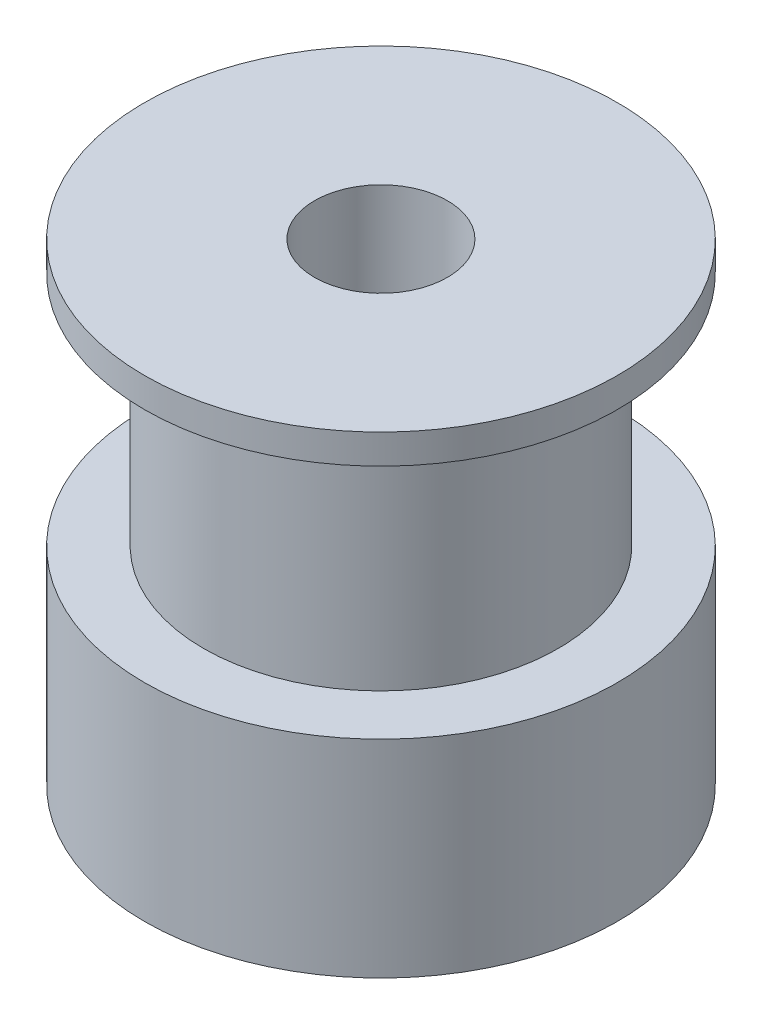
ISO-10303-21;
HEADER;
FILE_DESCRIPTION(('STEP AP214'),'2;1');
FILE_NAME('part.step','',(''),(''),'','','');
FILE_SCHEMA(('AUTOMOTIVE_DESIGN { 1 0 10303 214 1 1 1 1 }'));
ENDSEC;
DATA;
#1=APPLICATION_CONTEXT('core data for automotive mechanical design processes');
#2=APPLICATION_PROTOCOL_DEFINITION('international standard','automotive_design',2000,#1);
#3=PRODUCT_CONTEXT('',#1,'mechanical');
#4=PRODUCT('Part','Part','',(#3));
#5=PRODUCT_RELATED_PRODUCT_CATEGORY('part','',(#4));
#6=PRODUCT_DEFINITION_FORMATION('','',#4);
#7=PRODUCT_DEFINITION_CONTEXT('part definition',#1,'design');
#8=PRODUCT_DEFINITION('design','',#6,#7);
#9=PRODUCT_DEFINITION_SHAPE('','',#8);
#10=(LENGTH_UNIT() NAMED_UNIT(*) SI_UNIT(.MILLI.,.METRE.));
#11=(NAMED_UNIT(*) PLANE_ANGLE_UNIT() SI_UNIT($,.RADIAN.));
#12=(NAMED_UNIT(*) SI_UNIT($,.STERADIAN.) SOLID_ANGLE_UNIT());
#13=UNCERTAINTY_MEASURE_WITH_UNIT(LENGTH_MEASURE(1.E-05),#10,'distance_accuracy_value','');
#14=(GEOMETRIC_REPRESENTATION_CONTEXT(3) GLOBAL_UNCERTAINTY_ASSIGNED_CONTEXT((#13)) GLOBAL_UNIT_ASSIGNED_CONTEXT((#10,
#11,#12)) REPRESENTATION_CONTEXT('',''));
#15=CARTESIAN_POINT('',(0.,0.,0.));
#16=DIRECTION('',(0.,0.,1.));
#17=DIRECTION('',(1.,0.,0.));
#18=AXIS2_PLACEMENT_3D('',#15,#16,#17);
#19=CARTESIAN_POINT('',(0.,7.,0.));
#20=DIRECTION('',(0.,1.,0.));
#21=DIRECTION('',(0.,0.,1.));
#22=AXIS2_PLACEMENT_3D('',#19,#20,#21);
#23=PLANE('',#22);
#24=CARTESIAN_POINT('',(0.,7.,0.));
#25=DIRECTION('',(0.,1.,0.));
#26=DIRECTION('',(0.,0.,1.));
#27=AXIS2_PLACEMENT_3D('',#24,#25,#26);
#28=CIRCLE('',#27,8.);
#29=CARTESIAN_POINT('',(0.,7.,8.));
#30=VERTEX_POINT('',#29);
#31=EDGE_CURVE('E10',#30,#30,#28,.T.);
#32=ORIENTED_EDGE('',*,*,#31,.T.);
#33=EDGE_LOOP('',(#32));
#34=FACE_BOUND('',#33,.T.);
#35=CARTESIAN_POINT('',(0.,7.,0.));
#36=DIRECTION('',(0.,1.,0.));
#37=DIRECTION('',(0.,0.,1.));
#38=AXIS2_PLACEMENT_3D('',#35,#36,#37);
#39=CIRCLE('',#38,6.);
#40=CARTESIAN_POINT('',(0.,7.,6.));
#41=VERTEX_POINT('',#40);
#42=EDGE_CURVE('E42',#41,#41,#39,.T.);
#43=ORIENTED_EDGE('',*,*,#42,.F.);
#44=EDGE_LOOP('',(#43));
#45=FACE_BOUND('',#44,.T.);
#46=ADVANCED_FACE('F29',(#34,#45),#23,.T.);
#47=CARTESIAN_POINT('',(0.,7.,0.));
#48=DIRECTION('',(0.,-1.,0.));
#49=DIRECTION('',(0.,0.,-1.));
#50=AXIS2_PLACEMENT_3D('',#47,#48,#49);
#51=CYLINDRICAL_SURFACE('',#50,8.);
#52=ORIENTED_EDGE('',*,*,#31,.F.);
#53=EDGE_LOOP('',(#52));
#54=FACE_BOUND('',#53,.T.);
#55=CARTESIAN_POINT('',(0.,0.,0.));
#56=DIRECTION('',(0.,1.,0.));
#57=DIRECTION('',(0.,0.,1.));
#58=AXIS2_PLACEMENT_3D('',#55,#56,#57);
#59=CIRCLE('',#58,8.);
#60=CARTESIAN_POINT('',(0.,0.,8.));
#61=VERTEX_POINT('',#60);
#62=EDGE_CURVE('E33',#61,#61,#59,.T.);
#63=ORIENTED_EDGE('',*,*,#62,.T.);
#64=EDGE_LOOP('',(#63));
#65=FACE_BOUND('',#64,.T.);
#66=ADVANCED_FACE('F31',(#54,#65),#51,.T.);
#67=CARTESIAN_POINT('',(0.,0.,0.));
#68=DIRECTION('',(0.,1.,0.));
#69=DIRECTION('',(0.,0.,1.));
#70=AXIS2_PLACEMENT_3D('',#67,#68,#69);
#71=PLANE('',#70);
#72=CARTESIAN_POINT('',(0.,0.,0.));
#73=DIRECTION('',(0.,1.,0.));
#74=DIRECTION('',(0.,0.,1.));
#75=AXIS2_PLACEMENT_3D('',#72,#73,#74);
#76=CIRCLE('',#75,2.25);
#77=CARTESIAN_POINT('',(0.,0.,2.25));
#78=VERTEX_POINT('',#77);
#79=EDGE_CURVE('E51',#78,#78,#76,.F.);
#80=ORIENTED_EDGE('',*,*,#79,.F.);
#81=EDGE_LOOP('',(#80));
#82=FACE_BOUND('',#81,.T.);
#83=ORIENTED_EDGE('',*,*,#62,.F.);
#84=EDGE_LOOP('',(#83));
#85=FACE_BOUND('',#84,.T.);
#86=ADVANCED_FACE('F84',(#82,#85),#71,.F.);
#87=CARTESIAN_POINT('',(0.,15.,0.));
#88=DIRECTION('',(0.,-1.,0.));
#89=DIRECTION('',(0.,0.,-1.));
#90=AXIS2_PLACEMENT_3D('',#87,#88,#89);
#91=CYLINDRICAL_SURFACE('',#90,6.);
#92=CARTESIAN_POINT('',(0.,15.,0.));
#93=DIRECTION('',(0.,1.,0.));
#94=DIRECTION('',(0.,0.,1.));
#95=AXIS2_PLACEMENT_3D('',#92,#93,#94);
#96=CIRCLE('',#95,6.);
#97=CARTESIAN_POINT('',(0.,15.,6.));
#98=VERTEX_POINT('',#97);
#99=EDGE_CURVE('E40',#98,#98,#96,.T.);
#100=ORIENTED_EDGE('',*,*,#99,.F.);
#101=EDGE_LOOP('',(#100));
#102=FACE_BOUND('',#101,.T.);
#103=ORIENTED_EDGE('',*,*,#42,.T.);
#104=EDGE_LOOP('',(#103));
#105=FACE_BOUND('',#104,.T.);
#106=ADVANCED_FACE('F78',(#102,#105),#91,.T.);
#107=CARTESIAN_POINT('',(0.,15.,0.));
#108=DIRECTION('',(0.,1.,0.));
#109=DIRECTION('',(0.,0.,1.));
#110=AXIS2_PLACEMENT_3D('',#107,#108,#109);
#111=PLANE('',#110);
#112=CARTESIAN_POINT('',(0.,15.,0.));
#113=DIRECTION('',(0.,1.,0.));
#114=DIRECTION('',(0.,0.,1.));
#115=AXIS2_PLACEMENT_3D('',#112,#113,#114);
#116=CIRCLE('',#115,8.);
#117=CARTESIAN_POINT('',(0.,15.,8.));
#118=VERTEX_POINT('',#117);
#119=EDGE_CURVE('E48',#118,#118,#116,.T.);
#120=ORIENTED_EDGE('',*,*,#119,.F.);
#121=EDGE_LOOP('',(#120));
#122=FACE_BOUND('',#121,.T.);
#123=ORIENTED_EDGE('',*,*,#99,.T.);
#124=EDGE_LOOP('',(#123));
#125=FACE_BOUND('',#124,.T.);
#126=ADVANCED_FACE('F72',(#122,#125),#111,.F.);
#127=CARTESIAN_POINT('',(0.,16.,0.));
#128=DIRECTION('',(0.,-1.,0.));
#129=DIRECTION('',(0.,0.,-1.));
#130=AXIS2_PLACEMENT_3D('',#127,#128,#129);
#131=CYLINDRICAL_SURFACE('',#130,8.);
#132=CARTESIAN_POINT('',(0.,16.,0.));
#133=DIRECTION('',(0.,1.,0.));
#134=DIRECTION('',(0.,0.,1.));
#135=AXIS2_PLACEMENT_3D('',#132,#133,#134);
#136=CIRCLE('',#135,8.);
#137=CARTESIAN_POINT('',(0.,16.,8.));
#138=VERTEX_POINT('',#137);
#139=EDGE_CURVE('E45',#138,#138,#136,.T.);
#140=ORIENTED_EDGE('',*,*,#139,.F.);
#141=EDGE_LOOP('',(#140));
#142=FACE_BOUND('',#141,.T.);
#143=ORIENTED_EDGE('',*,*,#119,.T.);
#144=EDGE_LOOP('',(#143));
#145=FACE_BOUND('',#144,.T.);
#146=ADVANCED_FACE('F66',(#142,#145),#131,.T.);
#147=CARTESIAN_POINT('',(0.,16.,0.));
#148=DIRECTION('',(0.,1.,0.));
#149=DIRECTION('',(0.,0.,1.));
#150=AXIS2_PLACEMENT_3D('',#147,#148,#149);
#151=PLANE('',#150);
#152=CARTESIAN_POINT('',(0.,16.,0.));
#153=DIRECTION('',(0.,1.,0.));
#154=DIRECTION('',(0.,0.,1.));
#155=AXIS2_PLACEMENT_3D('',#152,#153,#154);
#156=CIRCLE('',#155,2.25);
#157=CARTESIAN_POINT('',(0.,16.,2.25));
#158=VERTEX_POINT('',#157);
#159=EDGE_CURVE('E56',#158,#158,#156,.T.);
#160=ORIENTED_EDGE('',*,*,#159,.F.);
#161=EDGE_LOOP('',(#160));
#162=FACE_BOUND('',#161,.T.);
#163=ORIENTED_EDGE('',*,*,#139,.T.);
#164=EDGE_LOOP('',(#163));
#165=FACE_BOUND('',#164,.T.);
#166=ADVANCED_FACE('F63',(#162,#165),#151,.T.);
#167=CARTESIAN_POINT('',(0.,-0.001000000000001,0.));
#168=DIRECTION('',(0.,1.,0.));
#169=DIRECTION('',(0.,0.,1.));
#170=AXIS2_PLACEMENT_3D('',#167,#168,#169);
#171=CYLINDRICAL_SURFACE('',#170,2.25);
#172=ORIENTED_EDGE('',*,*,#159,.T.);
#173=EDGE_LOOP('',(#172));
#174=FACE_BOUND('',#173,.T.);
#175=ORIENTED_EDGE('',*,*,#79,.T.);
#176=EDGE_LOOP('',(#175));
#177=FACE_BOUND('',#176,.T.);
#178=ADVANCED_FACE('F60',(#174,#177),#171,.F.);
#179=CLOSED_SHELL('',(#46,#66,#86,#106,#126,#146,#166,#178));
#180=MANIFOLD_SOLID_BREP('B2',#179);
#181=ADVANCED_BREP_SHAPE_REPRESENTATION('',(#18,#180),#14);
#182=SHAPE_DEFINITION_REPRESENTATION(#9,#181);
ENDSEC;
END-ISO-10303-21;
